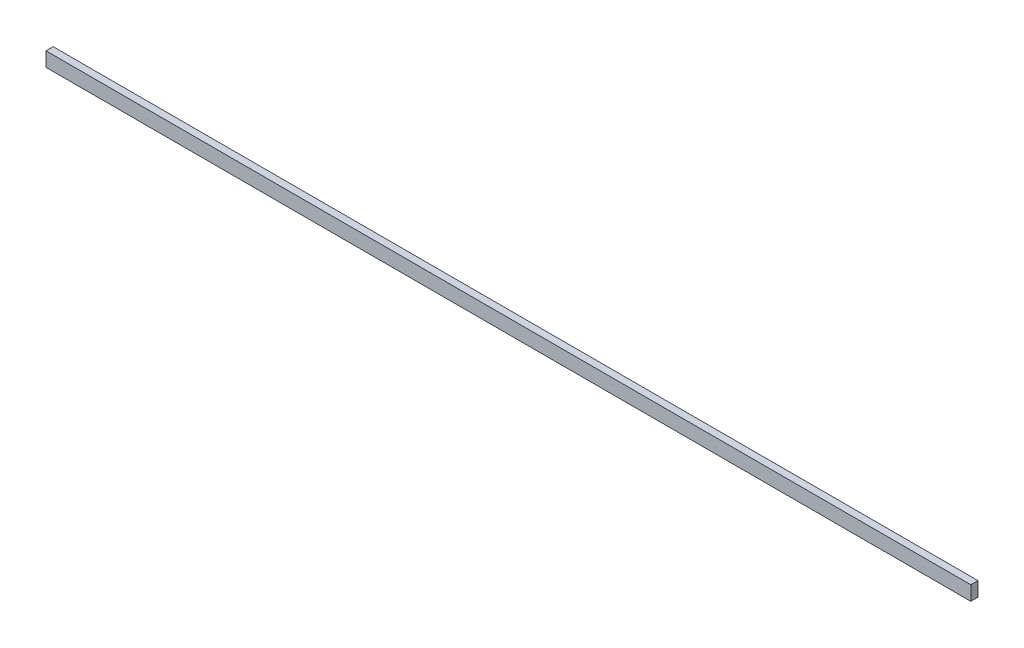
ISO-10303-21;
HEADER;
FILE_DESCRIPTION(('STEP AP214'),'2;1');
FILE_NAME('part.step','',(''),(''),'','','');
FILE_SCHEMA(('AUTOMOTIVE_DESIGN { 1 0 10303 214 1 1 1 1 }'));
ENDSEC;
DATA;
#1=APPLICATION_CONTEXT('core data for automotive mechanical design processes');
#2=APPLICATION_PROTOCOL_DEFINITION('international standard','automotive_design',2000,#1);
#3=PRODUCT_CONTEXT('',#1,'mechanical');
#4=PRODUCT('Part','Part','',(#3));
#5=PRODUCT_RELATED_PRODUCT_CATEGORY('part','',(#4));
#6=PRODUCT_DEFINITION_FORMATION('','',#4);
#7=PRODUCT_DEFINITION_CONTEXT('part definition',#1,'design');
#8=PRODUCT_DEFINITION('design','',#6,#7);
#9=PRODUCT_DEFINITION_SHAPE('','',#8);
#10=(LENGTH_UNIT() NAMED_UNIT(*) SI_UNIT(.MILLI.,.METRE.));
#11=(NAMED_UNIT(*) PLANE_ANGLE_UNIT() SI_UNIT($,.RADIAN.));
#12=(NAMED_UNIT(*) SI_UNIT($,.STERADIAN.) SOLID_ANGLE_UNIT());
#13=UNCERTAINTY_MEASURE_WITH_UNIT(LENGTH_MEASURE(1.E-05),#10,'distance_accuracy_value','');
#14=(GEOMETRIC_REPRESENTATION_CONTEXT(3) GLOBAL_UNCERTAINTY_ASSIGNED_CONTEXT((#13)) GLOBAL_UNIT_ASSIGNED_CONTEXT((#10,
#11,#12)) REPRESENTATION_CONTEXT('',''));
#15=CARTESIAN_POINT('',(0.,0.,0.));
#16=DIRECTION('',(0.,0.,1.));
#17=DIRECTION('',(1.,0.,0.));
#18=AXIS2_PLACEMENT_3D('',#15,#16,#17);
#19=CARTESIAN_POINT('',(645.,5.,2.5));
#20=DIRECTION('',(0.,0.,-1.));
#21=DIRECTION('',(0.,1.,0.));
#22=AXIS2_PLACEMENT_3D('',#19,#20,#21);
#23=PLANE('',#22);
#24=DIRECTION('',(0.,-1.,0.));
#25=VECTOR('',#24,1.);
#26=CARTESIAN_POINT('',(0.,5.,2.5));
#27=LINE('',#26,#25);
#28=CARTESIAN_POINT('',(0.,5.,2.5));
#29=VERTEX_POINT('',#28);
#30=CARTESIAN_POINT('',(0.,-5.,2.5));
#31=VERTEX_POINT('',#30);
#32=EDGE_CURVE('E111',#29,#31,#27,.T.);
#33=ORIENTED_EDGE('',*,*,#32,.T.);
#34=DIRECTION('',(-1.,0.,0.));
#35=VECTOR('',#34,1.);
#36=CARTESIAN_POINT('',(645.,-5.,2.5));
#37=LINE('',#36,#35);
#38=CARTESIAN_POINT('',(645.,-5.,2.5));
#39=VERTEX_POINT('',#38);
#40=EDGE_CURVE('E11',#39,#31,#37,.T.);
#41=ORIENTED_EDGE('',*,*,#40,.F.);
#42=DIRECTION('',(0.,-1.,0.));
#43=VECTOR('',#42,1.);
#44=CARTESIAN_POINT('',(645.,5.,2.5));
#45=LINE('',#44,#43);
#46=CARTESIAN_POINT('',(645.,5.,2.5));
#47=VERTEX_POINT('',#46);
#48=EDGE_CURVE('E95',#47,#39,#45,.T.);
#49=ORIENTED_EDGE('',*,*,#48,.F.);
#50=DIRECTION('',(-1.,0.,0.));
#51=VECTOR('',#50,1.);
#52=CARTESIAN_POINT('',(645.,5.,2.5));
#53=LINE('',#52,#51);
#54=EDGE_CURVE('E107',#47,#29,#53,.T.);
#55=ORIENTED_EDGE('',*,*,#54,.T.);
#56=EDGE_LOOP('',(#33,#41,#49,#55));
#57=FACE_BOUND('',#56,.T.);
#58=ADVANCED_FACE('F43',(#57),#23,.F.);
#59=CARTESIAN_POINT('',(645.,-5.,-2.5));
#60=DIRECTION('',(0.,1.,0.));
#61=DIRECTION('',(0.,0.,1.));
#62=AXIS2_PLACEMENT_3D('',#59,#60,#61);
#63=PLANE('',#62);
#64=DIRECTION('',(0.,0.,-1.));
#65=VECTOR('',#64,1.);
#66=CARTESIAN_POINT('',(0.,-5.,-2.5));
#67=LINE('',#66,#65);
#68=CARTESIAN_POINT('',(0.,-5.,-2.5));
#69=VERTEX_POINT('',#68);
#70=EDGE_CURVE('E100',#31,#69,#67,.T.);
#71=ORIENTED_EDGE('',*,*,#70,.T.);
#72=DIRECTION('',(-1.,0.,0.));
#73=VECTOR('',#72,1.);
#74=CARTESIAN_POINT('',(645.,-5.,-2.5));
#75=LINE('',#74,#73);
#76=CARTESIAN_POINT('',(645.,-5.,-2.5));
#77=VERTEX_POINT('',#76);
#78=EDGE_CURVE('E52',#77,#69,#75,.T.);
#79=ORIENTED_EDGE('',*,*,#78,.F.);
#80=DIRECTION('',(0.,0.,-1.));
#81=VECTOR('',#80,1.);
#82=CARTESIAN_POINT('',(645.,-5.,-2.5));
#83=LINE('',#82,#81);
#84=EDGE_CURVE('E90',#39,#77,#83,.T.);
#85=ORIENTED_EDGE('',*,*,#84,.F.);
#86=ORIENTED_EDGE('',*,*,#40,.T.);
#87=EDGE_LOOP('',(#71,#79,#85,#86));
#88=FACE_BOUND('',#87,.T.);
#89=ADVANCED_FACE('F99',(#88),#63,.F.);
#90=CARTESIAN_POINT('',(645.,5.,-2.5));
#91=DIRECTION('',(0.,0.,1.));
#92=DIRECTION('',(0.,-1.,0.));
#93=AXIS2_PLACEMENT_3D('',#90,#91,#92);
#94=PLANE('',#93);
#95=DIRECTION('',(0.,1.,0.));
#96=VECTOR('',#95,1.);
#97=CARTESIAN_POINT('',(0.,5.,-2.5));
#98=LINE('',#97,#96);
#99=CARTESIAN_POINT('',(0.,5.,-2.5));
#100=VERTEX_POINT('',#99);
#101=EDGE_CURVE('E77',#69,#100,#98,.T.);
#102=ORIENTED_EDGE('',*,*,#101,.T.);
#103=DIRECTION('',(-1.,0.,0.));
#104=VECTOR('',#103,1.);
#105=CARTESIAN_POINT('',(645.,5.,-2.5));
#106=LINE('',#105,#104);
#107=CARTESIAN_POINT('',(645.,5.,-2.5));
#108=VERTEX_POINT('',#107);
#109=EDGE_CURVE('E102',#108,#100,#106,.T.);
#110=ORIENTED_EDGE('',*,*,#109,.F.);
#111=DIRECTION('',(0.,1.,0.));
#112=VECTOR('',#111,1.);
#113=CARTESIAN_POINT('',(645.,5.,-2.5));
#114=LINE('',#113,#112);
#115=EDGE_CURVE('E93',#77,#108,#114,.T.);
#116=ORIENTED_EDGE('',*,*,#115,.F.);
#117=ORIENTED_EDGE('',*,*,#78,.T.);
#118=EDGE_LOOP('',(#102,#110,#116,#117));
#119=FACE_BOUND('',#118,.T.);
#120=ADVANCED_FACE('F103',(#119),#94,.F.);
#121=CARTESIAN_POINT('',(645.,5.,-2.5));
#122=DIRECTION('',(0.,-1.,0.));
#123=DIRECTION('',(0.,0.,-1.));
#124=AXIS2_PLACEMENT_3D('',#121,#122,#123);
#125=PLANE('',#124);
#126=DIRECTION('',(0.,0.,1.));
#127=VECTOR('',#126,1.);
#128=CARTESIAN_POINT('',(0.,5.,-2.5));
#129=LINE('',#128,#127);
#130=EDGE_CURVE('E83',#100,#29,#129,.T.);
#131=ORIENTED_EDGE('',*,*,#130,.T.);
#132=ORIENTED_EDGE('',*,*,#54,.F.);
#133=DIRECTION('',(0.,0.,1.));
#134=VECTOR('',#133,1.);
#135=CARTESIAN_POINT('',(645.,5.,-2.5));
#136=LINE('',#135,#134);
#137=EDGE_CURVE('E60',#108,#47,#136,.T.);
#138=ORIENTED_EDGE('',*,*,#137,.F.);
#139=ORIENTED_EDGE('',*,*,#109,.T.);
#140=EDGE_LOOP('',(#131,#132,#138,#139));
#141=FACE_BOUND('',#140,.T.);
#142=ADVANCED_FACE('F124',(#141),#125,.F.);
#143=CARTESIAN_POINT('',(645.,0.,0.));
#144=DIRECTION('',(-1.,0.,0.));
#145=DIRECTION('',(0.,0.,1.));
#146=AXIS2_PLACEMENT_3D('',#143,#144,#145);
#147=PLANE('',#146);
#148=ORIENTED_EDGE('',*,*,#48,.T.);
#149=ORIENTED_EDGE('',*,*,#84,.T.);
#150=ORIENTED_EDGE('',*,*,#115,.T.);
#151=ORIENTED_EDGE('',*,*,#137,.T.);
#152=EDGE_LOOP('',(#148,#149,#150,#151));
#153=FACE_BOUND('',#152,.T.);
#154=ADVANCED_FACE('F91',(#153),#147,.F.);
#155=CARTESIAN_POINT('',(0.,0.,0.));
#156=DIRECTION('',(-1.,0.,0.));
#157=DIRECTION('',(0.,0.,1.));
#158=AXIS2_PLACEMENT_3D('',#155,#156,#157);
#159=PLANE('',#158);
#160=ORIENTED_EDGE('',*,*,#32,.F.);
#161=ORIENTED_EDGE('',*,*,#130,.F.);
#162=ORIENTED_EDGE('',*,*,#101,.F.);
#163=ORIENTED_EDGE('',*,*,#70,.F.);
#164=EDGE_LOOP('',(#160,#161,#162,#163));
#165=FACE_BOUND('',#164,.T.);
#166=ADVANCED_FACE('F127',(#165),#159,.T.);
#167=CLOSED_SHELL('',(#58,#89,#120,#142,#154,#166));
#168=MANIFOLD_SOLID_BREP('B2',#167);
#169=ADVANCED_BREP_SHAPE_REPRESENTATION('',(#18,#168),#14);
#170=SHAPE_DEFINITION_REPRESENTATION(#9,#169);
ENDSEC;
END-ISO-10303-21;
